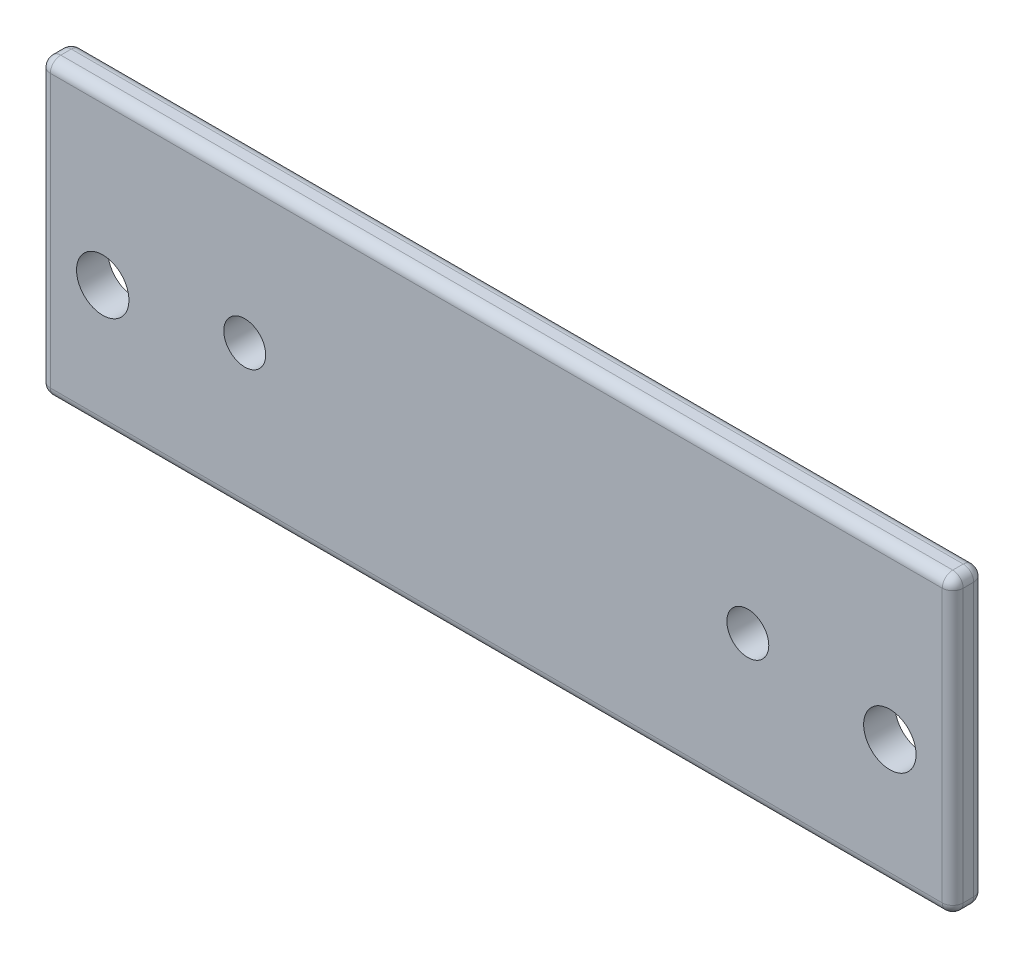
ISO-10303-21;
HEADER;
FILE_DESCRIPTION(('STEP AP214'),'2;1');
FILE_NAME('part.step','',(''),(''),'','','');
FILE_SCHEMA(('AUTOMOTIVE_DESIGN { 1 0 10303 214 1 1 1 1 }'));
ENDSEC;
DATA;
#1=APPLICATION_CONTEXT('core data for automotive mechanical design processes');
#2=APPLICATION_PROTOCOL_DEFINITION('international standard','automotive_design',2000,#1);
#3=PRODUCT_CONTEXT('',#1,'mechanical');
#4=PRODUCT('Part','Part','',(#3));
#5=PRODUCT_RELATED_PRODUCT_CATEGORY('part','',(#4));
#6=PRODUCT_DEFINITION_FORMATION('','',#4);
#7=PRODUCT_DEFINITION_CONTEXT('part definition',#1,'design');
#8=PRODUCT_DEFINITION('design','',#6,#7);
#9=PRODUCT_DEFINITION_SHAPE('','',#8);
#10=(LENGTH_UNIT() NAMED_UNIT(*) SI_UNIT(.MILLI.,.METRE.));
#11=(NAMED_UNIT(*) PLANE_ANGLE_UNIT() SI_UNIT($,.RADIAN.));
#12=(NAMED_UNIT(*) SI_UNIT($,.STERADIAN.) SOLID_ANGLE_UNIT());
#13=UNCERTAINTY_MEASURE_WITH_UNIT(LENGTH_MEASURE(1.E-05),#10,'distance_accuracy_value','');
#14=(GEOMETRIC_REPRESENTATION_CONTEXT(3) GLOBAL_UNCERTAINTY_ASSIGNED_CONTEXT((#13)) GLOBAL_UNIT_ASSIGNED_CONTEXT((#10,
#11,#12)) REPRESENTATION_CONTEXT('',''));
#15=CARTESIAN_POINT('',(0.,0.,0.));
#16=DIRECTION('',(0.,0.,1.));
#17=DIRECTION('',(1.,0.,0.));
#18=AXIS2_PLACEMENT_3D('',#15,#16,#17);
#19=CARTESIAN_POINT('',(-43.552187815,28.,3.));
#20=DIRECTION('',(1.,0.,0.));
#21=DIRECTION('',(0.,0.,-1.));
#22=AXIS2_PLACEMENT_3D('',#19,#20,#21);
#23=PLANE('',#22);
#24=DIRECTION('',(0.,-1.,0.));
#25=VECTOR('',#24,1.);
#26=CARTESIAN_POINT('',(-43.552187815,28.,2.));
#27=LINE('',#26,#25);
#28=CARTESIAN_POINT('',(-43.552187815,1.0000000000001,2.));
#29=VERTEX_POINT('',#28);
#30=CARTESIAN_POINT('',(-43.552187815,27.0000000000001,2.));
#31=VERTEX_POINT('',#30);
#32=EDGE_CURVE('E55',#29,#31,#27,.F.);
#33=ORIENTED_EDGE('',*,*,#32,.T.);
#34=DIRECTION('',(0.,0.,-1.));
#35=VECTOR('',#34,1.);
#36=CARTESIAN_POINT('',(-43.552187815,27.0000000000001,3.));
#37=LINE('',#36,#35);
#38=CARTESIAN_POINT('',(-43.552187815,27.0000000000001,1.));
#39=VERTEX_POINT('',#38);
#40=EDGE_CURVE('E11',#31,#39,#37,.T.);
#41=ORIENTED_EDGE('',*,*,#40,.T.);
#42=DIRECTION('',(0.,-1.,0.));
#43=VECTOR('',#42,1.);
#44=CARTESIAN_POINT('',(-43.552187815,0.,1.));
#45=LINE('',#44,#43);
#46=CARTESIAN_POINT('',(-43.552187815,1.0000000000001,1.));
#47=VERTEX_POINT('',#46);
#48=EDGE_CURVE('E240',#39,#47,#45,.T.);
#49=ORIENTED_EDGE('',*,*,#48,.T.);
#50=DIRECTION('',(0.,0.,-1.));
#51=VECTOR('',#50,1.);
#52=CARTESIAN_POINT('',(-43.552187815,1.0000000000001,3.));
#53=LINE('',#52,#51);
#54=EDGE_CURVE('E66',#47,#29,#53,.F.);
#55=ORIENTED_EDGE('',*,*,#54,.T.);
#56=EDGE_LOOP('',(#33,#41,#49,#55));
#57=FACE_BOUND('',#56,.T.);
#58=ADVANCED_FACE('F45',(#57),#23,.F.);
#59=CARTESIAN_POINT('',(43.552187815,0.,3.));
#60=DIRECTION('',(0.,1.,0.));
#61=DIRECTION('',(-1.,0.,0.));
#62=AXIS2_PLACEMENT_3D('',#59,#60,#61);
#63=PLANE('',#62);
#64=DIRECTION('',(1.,0.,0.));
#65=VECTOR('',#64,1.);
#66=CARTESIAN_POINT('',(43.552187815,0.,1.));
#67=LINE('',#66,#65);
#68=CARTESIAN_POINT('',(-42.552187815,0.,1.));
#69=VERTEX_POINT('',#68);
#70=CARTESIAN_POINT('',(42.552187815,0.,1.));
#71=VERTEX_POINT('',#70);
#72=EDGE_CURVE('E192',#69,#71,#67,.T.);
#73=ORIENTED_EDGE('',*,*,#72,.T.);
#74=DIRECTION('',(0.,0.,-1.));
#75=VECTOR('',#74,1.);
#76=CARTESIAN_POINT('',(42.552187815,0.,3.));
#77=LINE('',#76,#75);
#78=CARTESIAN_POINT('',(42.552187815,0.,2.));
#79=VERTEX_POINT('',#78);
#80=EDGE_CURVE('E199',#71,#79,#77,.F.);
#81=ORIENTED_EDGE('',*,*,#80,.T.);
#82=DIRECTION('',(1.,0.,0.));
#83=VECTOR('',#82,1.);
#84=CARTESIAN_POINT('',(43.552187815,0.,2.));
#85=LINE('',#84,#83);
#86=CARTESIAN_POINT('',(-42.552187815,0.,2.));
#87=VERTEX_POINT('',#86);
#88=EDGE_CURVE('E195',#79,#87,#85,.F.);
#89=ORIENTED_EDGE('',*,*,#88,.T.);
#90=DIRECTION('',(0.,0.,-1.));
#91=VECTOR('',#90,1.);
#92=CARTESIAN_POINT('',(-42.552187815,0.,3.));
#93=LINE('',#92,#91);
#94=EDGE_CURVE('E189',#87,#69,#93,.T.);
#95=ORIENTED_EDGE('',*,*,#94,.T.);
#96=EDGE_LOOP('',(#73,#81,#89,#95));
#97=FACE_BOUND('',#96,.T.);
#98=ADVANCED_FACE('F389',(#97),#63,.F.);
#99=CARTESIAN_POINT('',(43.552187815,28.,3.));
#100=DIRECTION('',(-1.,0.,0.));
#101=DIRECTION('',(0.,0.,1.));
#102=AXIS2_PLACEMENT_3D('',#99,#100,#101);
#103=PLANE('',#102);
#104=DIRECTION('',(0.,1.,0.));
#105=VECTOR('',#104,1.);
#106=CARTESIAN_POINT('',(43.552187815,28.,2.));
#107=LINE('',#106,#105);
#108=CARTESIAN_POINT('',(43.552187815,27.,2.));
#109=VERTEX_POINT('',#108);
#110=CARTESIAN_POINT('',(43.552187815,1.,2.));
#111=VERTEX_POINT('',#110);
#112=EDGE_CURVE('E221',#109,#111,#107,.F.);
#113=ORIENTED_EDGE('',*,*,#112,.T.);
#114=DIRECTION('',(0.,0.,-1.));
#115=VECTOR('',#114,1.);
#116=CARTESIAN_POINT('',(43.552187815,1.,3.));
#117=LINE('',#116,#115);
#118=CARTESIAN_POINT('',(43.552187815,1.,1.));
#119=VERTEX_POINT('',#118);
#120=EDGE_CURVE('E224',#111,#119,#117,.T.);
#121=ORIENTED_EDGE('',*,*,#120,.T.);
#122=DIRECTION('',(0.,1.,0.));
#123=VECTOR('',#122,1.);
#124=CARTESIAN_POINT('',(43.552187815,28.,1.));
#125=LINE('',#124,#123);
#126=CARTESIAN_POINT('',(43.552187815,27.,1.));
#127=VERTEX_POINT('',#126);
#128=EDGE_CURVE('E218',#119,#127,#125,.T.);
#129=ORIENTED_EDGE('',*,*,#128,.T.);
#130=DIRECTION('',(0.,0.,-1.));
#131=VECTOR('',#130,1.);
#132=CARTESIAN_POINT('',(43.552187815,27.,3.));
#133=LINE('',#132,#131);
#134=EDGE_CURVE('E215',#127,#109,#133,.F.);
#135=ORIENTED_EDGE('',*,*,#134,.T.);
#136=EDGE_LOOP('',(#113,#121,#129,#135));
#137=FACE_BOUND('',#136,.T.);
#138=ADVANCED_FACE('F395',(#137),#103,.F.);
#139=CARTESIAN_POINT('',(37.552187815,28.,3.));
#140=DIRECTION('',(0.,-1.,0.));
#141=DIRECTION('',(1.,0.,0.));
#142=AXIS2_PLACEMENT_3D('',#139,#140,#141);
#143=PLANE('',#142);
#144=DIRECTION('',(-1.,0.,0.));
#145=VECTOR('',#144,1.);
#146=CARTESIAN_POINT('',(37.552187815,28.,2.));
#147=LINE('',#146,#145);
#148=CARTESIAN_POINT('',(-42.552187815,28.0000000000001,2.));
#149=VERTEX_POINT('',#148);
#150=CARTESIAN_POINT('',(42.552187815,28.,2.));
#151=VERTEX_POINT('',#150);
#152=EDGE_CURVE('E153',#149,#151,#147,.F.);
#153=ORIENTED_EDGE('',*,*,#152,.T.);
#154=DIRECTION('',(0.,0.,-1.));
#155=VECTOR('',#154,1.);
#156=CARTESIAN_POINT('',(42.552187815,28.,3.));
#157=LINE('',#156,#155);
#158=CARTESIAN_POINT('',(42.552187815,28.,1.));
#159=VERTEX_POINT('',#158);
#160=EDGE_CURVE('E236',#151,#159,#157,.T.);
#161=ORIENTED_EDGE('',*,*,#160,.T.);
#162=DIRECTION('',(-1.,0.,0.));
#163=VECTOR('',#162,1.);
#164=CARTESIAN_POINT('',(-43.552187815,28.0000000000001,1.));
#165=LINE('',#164,#163);
#166=CARTESIAN_POINT('',(-42.552187815,28.0000000000001,1.));
#167=VERTEX_POINT('',#166);
#168=EDGE_CURVE('E231',#159,#167,#165,.T.);
#169=ORIENTED_EDGE('',*,*,#168,.T.);
#170=DIRECTION('',(0.,0.,-1.));
#171=VECTOR('',#170,1.);
#172=CARTESIAN_POINT('',(-42.552187815,28.0000000000001,3.));
#173=LINE('',#172,#171);
#174=EDGE_CURVE('E228',#167,#149,#173,.F.);
#175=ORIENTED_EDGE('',*,*,#174,.T.);
#176=EDGE_LOOP('',(#153,#161,#169,#175));
#177=FACE_BOUND('',#176,.T.);
#178=ADVANCED_FACE('F366',(#177),#143,.F.);
#179=CARTESIAN_POINT('',(0.,0.,3.));
#180=DIRECTION('',(0.,0.,-1.));
#181=DIRECTION('',(-1.,0.,0.));
#182=AXIS2_PLACEMENT_3D('',#179,#180,#181);
#183=PLANE('',#182);
#184=DIRECTION('',(0.,-1.,0.));
#185=VECTOR('',#184,1.);
#186=CARTESIAN_POINT('',(-42.552187815,0.,3.));
#187=LINE('',#186,#185);
#188=CARTESIAN_POINT('',(-42.552187815,27.0000000000001,3.));
#189=VERTEX_POINT('',#188);
#190=CARTESIAN_POINT('',(-42.552187815,1.0000000000001,3.));
#191=VERTEX_POINT('',#190);
#192=EDGE_CURVE('E139',#189,#191,#187,.T.);
#193=ORIENTED_EDGE('',*,*,#192,.T.);
#194=DIRECTION('',(1.,0.,0.));
#195=VECTOR('',#194,1.);
#196=CARTESIAN_POINT('',(0.,1.00000000000005,3.));
#197=LINE('',#196,#195);
#198=CARTESIAN_POINT('',(42.552187815,1.,3.));
#199=VERTEX_POINT('',#198);
#200=EDGE_CURVE('E186',#191,#199,#197,.T.);
#201=ORIENTED_EDGE('',*,*,#200,.T.);
#202=DIRECTION('',(0.,1.,0.));
#203=VECTOR('',#202,1.);
#204=CARTESIAN_POINT('',(42.552187815,0.,3.));
#205=LINE('',#204,#203);
#206=CARTESIAN_POINT('',(42.552187815,27.,3.));
#207=VERTEX_POINT('',#206);
#208=EDGE_CURVE('E142',#199,#207,#205,.T.);
#209=ORIENTED_EDGE('',*,*,#208,.T.);
#210=DIRECTION('',(-1.,0.,0.));
#211=VECTOR('',#210,1.);
#212=CARTESIAN_POINT('',(0.,27.,3.));
#213=LINE('',#212,#211);
#214=EDGE_CURVE('E133',#207,#189,#213,.T.);
#215=ORIENTED_EDGE('',*,*,#214,.T.);
#216=EDGE_LOOP('',(#193,#201,#209,#215));
#217=FACE_BOUND('',#216,.T.);
#218=CARTESIAN_POINT('',(-24.,14.,3.));
#219=DIRECTION('',(0.,0.,1.));
#220=DIRECTION('',(1.,0.,0.));
#221=AXIS2_PLACEMENT_3D('',#218,#219,#220);
#222=CIRCLE('',#221,2.00000000000001);
#223=CARTESIAN_POINT('',(-22.,14.,3.));
#224=VERTEX_POINT('',#223);
#225=EDGE_CURVE('E336',#224,#224,#222,.T.);
#226=ORIENTED_EDGE('',*,*,#225,.F.);
#227=EDGE_LOOP('',(#226));
#228=FACE_BOUND('',#227,.T.);
#229=CARTESIAN_POINT('',(24.,14.,3.));
#230=DIRECTION('',(0.,0.,1.));
#231=DIRECTION('',(1.,0.,0.));
#232=AXIS2_PLACEMENT_3D('',#229,#230,#231);
#233=CIRCLE('',#232,2.);
#234=CARTESIAN_POINT('',(26.,14.,3.));
#235=VERTEX_POINT('',#234);
#236=EDGE_CURVE('E330',#235,#235,#233,.T.);
#237=ORIENTED_EDGE('',*,*,#236,.F.);
#238=EDGE_LOOP('',(#237));
#239=FACE_BOUND('',#238,.T.);
#240=CARTESIAN_POINT('',(-37.552187815,12.,3.));
#241=DIRECTION('',(0.,0.,1.));
#242=DIRECTION('',(1.,0.,0.));
#243=AXIS2_PLACEMENT_3D('',#240,#241,#242);
#244=CIRCLE('',#243,2.5);
#245=CARTESIAN_POINT('',(-35.052187815,12.,3.));
#246=VERTEX_POINT('',#245);
#247=EDGE_CURVE('E178',#246,#246,#244,.T.);
#248=ORIENTED_EDGE('',*,*,#247,.F.);
#249=EDGE_LOOP('',(#248));
#250=FACE_BOUND('',#249,.T.);
#251=CARTESIAN_POINT('',(37.552187815,12.,3.));
#252=DIRECTION('',(0.,0.,1.));
#253=DIRECTION('',(1.,0.,0.));
#254=AXIS2_PLACEMENT_3D('',#251,#252,#253);
#255=CIRCLE('',#254,2.5);
#256=CARTESIAN_POINT('',(40.052187815,12.,3.));
#257=VERTEX_POINT('',#256);
#258=EDGE_CURVE('E344',#257,#257,#255,.T.);
#259=ORIENTED_EDGE('',*,*,#258,.F.);
#260=EDGE_LOOP('',(#259));
#261=FACE_BOUND('',#260,.T.);
#262=ADVANCED_FACE('F135',(#217,#228,#239,#250,#261),#183,.F.);
#263=CARTESIAN_POINT('',(0.,0.,0.));
#264=DIRECTION('',(0.,0.,-1.));
#265=DIRECTION('',(-1.,0.,0.));
#266=AXIS2_PLACEMENT_3D('',#263,#264,#265);
#267=PLANE('',#266);
#268=DIRECTION('',(0.,1.,0.));
#269=VECTOR('',#268,1.);
#270=CARTESIAN_POINT('',(42.552187815,0.,0.));
#271=LINE('',#270,#269);
#272=CARTESIAN_POINT('',(42.552187815,27.,0.));
#273=VERTEX_POINT('',#272);
#274=CARTESIAN_POINT('',(42.552187815,1.,0.));
#275=VERTEX_POINT('',#274);
#276=EDGE_CURVE('E208',#273,#275,#271,.F.);
#277=ORIENTED_EDGE('',*,*,#276,.T.);
#278=DIRECTION('',(1.,0.,0.));
#279=VECTOR('',#278,1.);
#280=CARTESIAN_POINT('',(-43.552187815,1.0000000000001,0.));
#281=LINE('',#280,#279);
#282=CARTESIAN_POINT('',(-42.552187815,1.0000000000001,0.));
#283=VERTEX_POINT('',#282);
#284=EDGE_CURVE('E211',#275,#283,#281,.F.);
#285=ORIENTED_EDGE('',*,*,#284,.T.);
#286=DIRECTION('',(0.,-1.,0.));
#287=VECTOR('',#286,1.);
#288=CARTESIAN_POINT('',(-42.552187815,28.,0.));
#289=LINE('',#288,#287);
#290=CARTESIAN_POINT('',(-42.552187815,27.0000000000001,0.));
#291=VERTEX_POINT('',#290);
#292=EDGE_CURVE('E202',#283,#291,#289,.F.);
#293=ORIENTED_EDGE('',*,*,#292,.T.);
#294=DIRECTION('',(-1.,0.,0.));
#295=VECTOR('',#294,1.);
#296=CARTESIAN_POINT('',(43.552187815,27.,0.));
#297=LINE('',#296,#295);
#298=EDGE_CURVE('E205',#291,#273,#297,.F.);
#299=ORIENTED_EDGE('',*,*,#298,.T.);
#300=EDGE_LOOP('',(#277,#285,#293,#299));
#301=FACE_BOUND('',#300,.T.);
#302=CARTESIAN_POINT('',(-24.,14.,0.));
#303=DIRECTION('',(0.,0.,-1.));
#304=DIRECTION('',(-1.,0.,0.));
#305=AXIS2_PLACEMENT_3D('',#302,#303,#304);
#306=CIRCLE('',#305,2.00000000000001);
#307=CARTESIAN_POINT('',(-26.,14.,0.));
#308=VERTEX_POINT('',#307);
#309=EDGE_CURVE('E339',#308,#308,#306,.F.);
#310=ORIENTED_EDGE('',*,*,#309,.T.);
#311=EDGE_LOOP('',(#310));
#312=FACE_BOUND('',#311,.T.);
#313=CARTESIAN_POINT('',(24.,14.,0.));
#314=DIRECTION('',(0.,0.,-1.));
#315=DIRECTION('',(-1.,0.,0.));
#316=AXIS2_PLACEMENT_3D('',#313,#314,#315);
#317=CIRCLE('',#316,2.);
#318=CARTESIAN_POINT('',(22.,14.,0.));
#319=VERTEX_POINT('',#318);
#320=EDGE_CURVE('E323',#319,#319,#317,.F.);
#321=ORIENTED_EDGE('',*,*,#320,.T.);
#322=EDGE_LOOP('',(#321));
#323=FACE_BOUND('',#322,.T.);
#324=CARTESIAN_POINT('',(-37.552187815,12.,0.));
#325=DIRECTION('',(0.,0.,1.));
#326=DIRECTION('',(1.,0.,0.));
#327=AXIS2_PLACEMENT_3D('',#324,#325,#326);
#328=CIRCLE('',#327,2.5);
#329=CARTESIAN_POINT('',(-35.052187815,12.,0.));
#330=VERTEX_POINT('',#329);
#331=EDGE_CURVE('E174',#330,#330,#328,.T.);
#332=ORIENTED_EDGE('',*,*,#331,.T.);
#333=EDGE_LOOP('',(#332));
#334=FACE_BOUND('',#333,.T.);
#335=CARTESIAN_POINT('',(37.552187815,12.,0.));
#336=DIRECTION('',(0.,0.,1.));
#337=DIRECTION('',(1.,0.,0.));
#338=AXIS2_PLACEMENT_3D('',#335,#336,#337);
#339=CIRCLE('',#338,2.5);
#340=CARTESIAN_POINT('',(40.052187815,12.,0.));
#341=VERTEX_POINT('',#340);
#342=EDGE_CURVE('E181',#341,#341,#339,.T.);
#343=ORIENTED_EDGE('',*,*,#342,.T.);
#344=EDGE_LOOP('',(#343));
#345=FACE_BOUND('',#344,.T.);
#346=ADVANCED_FACE('F365',(#301,#312,#323,#334,#345),#267,.T.);
#347=CARTESIAN_POINT('',(37.552187815,12.,0.));
#348=DIRECTION('',(0.,0.,1.));
#349=DIRECTION('',(1.,0.,0.));
#350=AXIS2_PLACEMENT_3D('',#347,#348,#349);
#351=CYLINDRICAL_SURFACE('',#350,2.5);
#352=ORIENTED_EDGE('',*,*,#342,.F.);
#353=EDGE_LOOP('',(#352));
#354=FACE_BOUND('',#353,.T.);
#355=ORIENTED_EDGE('',*,*,#258,.T.);
#356=EDGE_LOOP('',(#355));
#357=FACE_BOUND('',#356,.T.);
#358=ADVANCED_FACE('F376',(#354,#357),#351,.F.);
#359=CARTESIAN_POINT('',(-37.552187815,12.,0.));
#360=DIRECTION('',(0.,0.,1.));
#361=DIRECTION('',(1.,0.,0.));
#362=AXIS2_PLACEMENT_3D('',#359,#360,#361);
#363=CYLINDRICAL_SURFACE('',#362,2.5);
#364=ORIENTED_EDGE('',*,*,#331,.F.);
#365=EDGE_LOOP('',(#364));
#366=FACE_BOUND('',#365,.T.);
#367=ORIENTED_EDGE('',*,*,#247,.T.);
#368=EDGE_LOOP('',(#367));
#369=FACE_BOUND('',#368,.T.);
#370=ADVANCED_FACE('F373',(#366,#369),#363,.F.);
#371=CARTESIAN_POINT('',(24.,14.,-5.6568542494924));
#372=DIRECTION('',(0.,0.,1.));
#373=DIRECTION('',(1.,0.,0.));
#374=AXIS2_PLACEMENT_3D('',#371,#372,#373);
#375=CYLINDRICAL_SURFACE('',#374,2.);
#376=ORIENTED_EDGE('',*,*,#236,.T.);
#377=EDGE_LOOP('',(#376));
#378=FACE_BOUND('',#377,.T.);
#379=ORIENTED_EDGE('',*,*,#320,.F.);
#380=EDGE_LOOP('',(#379));
#381=FACE_BOUND('',#380,.T.);
#382=ADVANCED_FACE('F375',(#378,#381),#375,.F.);
#383=CARTESIAN_POINT('',(-24.,14.,-5.6568542494924));
#384=DIRECTION('',(0.,0.,1.));
#385=DIRECTION('',(1.,0.,0.));
#386=AXIS2_PLACEMENT_3D('',#383,#384,#385);
#387=CYLINDRICAL_SURFACE('',#386,2.00000000000001);
#388=ORIENTED_EDGE('',*,*,#225,.T.);
#389=EDGE_LOOP('',(#388));
#390=FACE_BOUND('',#389,.T.);
#391=ORIENTED_EDGE('',*,*,#309,.F.);
#392=EDGE_LOOP('',(#391));
#393=FACE_BOUND('',#392,.T.);
#394=ADVANCED_FACE('F361',(#390,#393),#387,.F.);
#395=CARTESIAN_POINT('',(37.552187815,27.,1.));
#396=DIRECTION('',(1.,0.,0.));
#397=DIRECTION('',(0.,1.,0.));
#398=AXIS2_PLACEMENT_3D('',#395,#396,#397);
#399=CYLINDRICAL_SURFACE('',#398,1.);
#400=CARTESIAN_POINT('',(-42.552187815,27.0000000000001,1.));
#401=DIRECTION('',(-1.,0.,0.));
#402=DIRECTION('',(0.,0.,1.));
#403=AXIS2_PLACEMENT_3D('',#400,#401,#402);
#404=CIRCLE('',#403,1.);
#405=EDGE_CURVE('E49',#167,#291,#404,.T.);
#406=ORIENTED_EDGE('',*,*,#405,.F.);
#407=ORIENTED_EDGE('',*,*,#168,.F.);
#408=CARTESIAN_POINT('',(42.552187815,27.,1.));
#409=DIRECTION('',(1.,0.,0.));
#410=DIRECTION('',(0.,0.,-1.));
#411=AXIS2_PLACEMENT_3D('',#408,#409,#410);
#412=CIRCLE('',#411,1.);
#413=EDGE_CURVE('E313',#273,#159,#412,.T.);
#414=ORIENTED_EDGE('',*,*,#413,.F.);
#415=ORIENTED_EDGE('',*,*,#298,.F.);
#416=EDGE_LOOP('',(#406,#407,#414,#415));
#417=FACE_BOUND('',#416,.T.);
#418=ADVANCED_FACE('F47',(#417),#399,.T.);
#419=CARTESIAN_POINT('',(-42.552187815,27.0000000000001,1.));
#420=DIRECTION('',(0.,0.,-1.));
#421=DIRECTION('',(-1.,0.,0.));
#422=AXIS2_PLACEMENT_3D('',#419,#420,#421);
#423=SPHERICAL_SURFACE('',#422,1.);
#424=CARTESIAN_POINT('',(-42.552187815,27.0000000000001,1.));
#425=DIRECTION('',(0.,0.,-1.));
#426=DIRECTION('',(-1.,0.,0.));
#427=AXIS2_PLACEMENT_3D('',#424,#425,#426);
#428=CIRCLE('',#427,1.);
#429=EDGE_CURVE('E306',#167,#39,#428,.F.);
#430=ORIENTED_EDGE('',*,*,#429,.F.);
#431=ORIENTED_EDGE('',*,*,#405,.T.);
#432=CARTESIAN_POINT('',(-42.552187815,27.0000000000001,1.));
#433=DIRECTION('',(0.,1.,0.));
#434=DIRECTION('',(0.,0.,1.));
#435=AXIS2_PLACEMENT_3D('',#432,#433,#434);
#436=CIRCLE('',#435,1.);
#437=EDGE_CURVE('E310',#39,#291,#436,.F.);
#438=ORIENTED_EDGE('',*,*,#437,.F.);
#439=EDGE_LOOP('',(#430,#431,#438));
#440=FACE_BOUND('',#439,.T.);
#441=ADVANCED_FACE('F464',(#440),#423,.T.);
#442=CARTESIAN_POINT('',(42.552187815,27.,1.));
#443=DIRECTION('',(0.,1.,0.));
#444=DIRECTION('',(0.,0.,1.));
#445=AXIS2_PLACEMENT_3D('',#442,#443,#444);
#446=SPHERICAL_SURFACE('',#445,1.);
#447=CARTESIAN_POINT('',(42.552187815,27.,1.));
#448=DIRECTION('',(0.,1.,0.));
#449=DIRECTION('',(0.,0.,1.));
#450=AXIS2_PLACEMENT_3D('',#447,#448,#449);
#451=CIRCLE('',#450,1.);
#452=EDGE_CURVE('E299',#273,#127,#451,.F.);
#453=ORIENTED_EDGE('',*,*,#452,.F.);
#454=ORIENTED_EDGE('',*,*,#413,.T.);
#455=CARTESIAN_POINT('',(42.552187815,27.,1.));
#456=DIRECTION('',(0.,0.,-1.));
#457=DIRECTION('',(-1.,0.,0.));
#458=AXIS2_PLACEMENT_3D('',#455,#456,#457);
#459=CIRCLE('',#458,1.);
#460=EDGE_CURVE('E303',#127,#159,#459,.F.);
#461=ORIENTED_EDGE('',*,*,#460,.F.);
#462=EDGE_LOOP('',(#453,#454,#461));
#463=FACE_BOUND('',#462,.T.);
#464=ADVANCED_FACE('F461',(#463),#446,.T.);
#465=CARTESIAN_POINT('',(-42.552187815,28.,1.));
#466=DIRECTION('',(0.,1.,0.));
#467=DIRECTION('',(0.,0.,1.));
#468=AXIS2_PLACEMENT_3D('',#465,#466,#467);
#469=CYLINDRICAL_SURFACE('',#468,1.);
#470=ORIENTED_EDGE('',*,*,#437,.T.);
#471=ORIENTED_EDGE('',*,*,#292,.F.);
#472=CARTESIAN_POINT('',(-42.552187815,1.0000000000001,1.));
#473=DIRECTION('',(0.,-1.,0.));
#474=DIRECTION('',(0.,0.,-1.));
#475=AXIS2_PLACEMENT_3D('',#472,#473,#474);
#476=CIRCLE('',#475,1.);
#477=EDGE_CURVE('E292',#47,#283,#476,.T.);
#478=ORIENTED_EDGE('',*,*,#477,.F.);
#479=ORIENTED_EDGE('',*,*,#48,.F.);
#480=EDGE_LOOP('',(#470,#471,#478,#479));
#481=FACE_BOUND('',#480,.T.);
#482=ADVANCED_FACE('F457',(#481),#469,.T.);
#483=CARTESIAN_POINT('',(-42.552187815,27.0000000000001,3.));
#484=DIRECTION('',(0.,0.,-1.));
#485=DIRECTION('',(-1.,0.,0.));
#486=AXIS2_PLACEMENT_3D('',#483,#484,#485);
#487=CYLINDRICAL_SURFACE('',#486,1.);
#488=ORIENTED_EDGE('',*,*,#429,.T.);
#489=ORIENTED_EDGE('',*,*,#40,.F.);
#490=CARTESIAN_POINT('',(-42.552187815,27.0000000000001,2.));
#491=DIRECTION('',(0.,0.,1.));
#492=DIRECTION('',(1.,0.,0.));
#493=AXIS2_PLACEMENT_3D('',#490,#491,#492);
#494=CIRCLE('',#493,1.);
#495=EDGE_CURVE('E158',#149,#31,#494,.T.);
#496=ORIENTED_EDGE('',*,*,#495,.F.);
#497=ORIENTED_EDGE('',*,*,#174,.F.);
#498=EDGE_LOOP('',(#488,#489,#496,#497));
#499=FACE_BOUND('',#498,.T.);
#500=ADVANCED_FACE('F454',(#499),#487,.T.);
#501=CARTESIAN_POINT('',(0.,27.,2.));
#502=DIRECTION('',(-1.,0.,0.));
#503=DIRECTION('',(0.,-1.,0.));
#504=AXIS2_PLACEMENT_3D('',#501,#502,#503);
#505=CYLINDRICAL_SURFACE('',#504,1.);
#506=CARTESIAN_POINT('',(42.552187815,27.,2.));
#507=DIRECTION('',(1.,0.,0.));
#508=DIRECTION('',(0.,0.,-1.));
#509=AXIS2_PLACEMENT_3D('',#506,#507,#508);
#510=CIRCLE('',#509,1.);
#511=EDGE_CURVE('E159',#151,#207,#510,.T.);
#512=ORIENTED_EDGE('',*,*,#511,.F.);
#513=ORIENTED_EDGE('',*,*,#152,.F.);
#514=CARTESIAN_POINT('',(-42.552187815,27.0000000000001,2.));
#515=DIRECTION('',(-1.,0.,0.));
#516=DIRECTION('',(0.,0.,1.));
#517=AXIS2_PLACEMENT_3D('',#514,#515,#516);
#518=CIRCLE('',#517,1.);
#519=EDGE_CURVE('E150',#189,#149,#518,.T.);
#520=ORIENTED_EDGE('',*,*,#519,.F.);
#521=ORIENTED_EDGE('',*,*,#214,.F.);
#522=EDGE_LOOP('',(#512,#513,#520,#521));
#523=FACE_BOUND('',#522,.T.);
#524=ADVANCED_FACE('F152',(#523),#505,.T.);
#525=CARTESIAN_POINT('',(42.552187815,27.,3.));
#526=DIRECTION('',(0.,0.,-1.));
#527=DIRECTION('',(-1.,0.,0.));
#528=AXIS2_PLACEMENT_3D('',#525,#526,#527);
#529=CYLINDRICAL_SURFACE('',#528,1.);
#530=ORIENTED_EDGE('',*,*,#460,.T.);
#531=ORIENTED_EDGE('',*,*,#160,.F.);
#532=CARTESIAN_POINT('',(42.552187815,27.,2.));
#533=DIRECTION('',(0.,0.,1.));
#534=DIRECTION('',(1.,0.,0.));
#535=AXIS2_PLACEMENT_3D('',#532,#533,#534);
#536=CIRCLE('',#535,1.);
#537=EDGE_CURVE('E284',#109,#151,#536,.T.);
#538=ORIENTED_EDGE('',*,*,#537,.F.);
#539=ORIENTED_EDGE('',*,*,#134,.F.);
#540=EDGE_LOOP('',(#530,#531,#538,#539));
#541=FACE_BOUND('',#540,.T.);
#542=ADVANCED_FACE('F447',(#541),#529,.T.);
#543=CARTESIAN_POINT('',(42.552187815,28.,1.));
#544=DIRECTION('',(0.,-1.,0.));
#545=DIRECTION('',(0.,0.,-1.));
#546=AXIS2_PLACEMENT_3D('',#543,#544,#545);
#547=CYLINDRICAL_SURFACE('',#546,1.);
#548=ORIENTED_EDGE('',*,*,#452,.T.);
#549=ORIENTED_EDGE('',*,*,#128,.F.);
#550=CARTESIAN_POINT('',(42.552187815,1.,1.));
#551=DIRECTION('',(0.,-1.,0.));
#552=DIRECTION('',(1.,0.,0.));
#553=AXIS2_PLACEMENT_3D('',#550,#551,#552);
#554=CIRCLE('',#553,1.);
#555=EDGE_CURVE('E280',#275,#119,#554,.T.);
#556=ORIENTED_EDGE('',*,*,#555,.F.);
#557=ORIENTED_EDGE('',*,*,#276,.F.);
#558=EDGE_LOOP('',(#548,#549,#556,#557));
#559=FACE_BOUND('',#558,.T.);
#560=ADVANCED_FACE('F443',(#559),#547,.T.);
#561=CARTESIAN_POINT('',(43.552187815,1.,1.));
#562=DIRECTION('',(-1.,0.,0.));
#563=DIRECTION('',(0.,-1.,0.));
#564=AXIS2_PLACEMENT_3D('',#561,#562,#563);
#565=CYLINDRICAL_SURFACE('',#564,1.);
#566=CARTESIAN_POINT('',(-42.552187815,1.0000000000001,1.));
#567=DIRECTION('',(-1.,0.,0.));
#568=DIRECTION('',(0.,0.,1.));
#569=AXIS2_PLACEMENT_3D('',#566,#567,#568);
#570=CIRCLE('',#569,1.);
#571=EDGE_CURVE('E295',#283,#69,#570,.T.);
#572=ORIENTED_EDGE('',*,*,#571,.F.);
#573=ORIENTED_EDGE('',*,*,#284,.F.);
#574=CARTESIAN_POINT('',(42.552187815,1.,1.));
#575=DIRECTION('',(1.,0.,0.));
#576=DIRECTION('',(0.,0.,-1.));
#577=AXIS2_PLACEMENT_3D('',#574,#575,#576);
#578=CIRCLE('',#577,1.);
#579=EDGE_CURVE('E276',#71,#275,#578,.T.);
#580=ORIENTED_EDGE('',*,*,#579,.F.);
#581=ORIENTED_EDGE('',*,*,#72,.F.);
#582=EDGE_LOOP('',(#572,#573,#580,#581));
#583=FACE_BOUND('',#582,.T.);
#584=ADVANCED_FACE('F439',(#583),#565,.T.);
#585=CARTESIAN_POINT('',(-42.552187815,1.0000000000001,1.));
#586=DIRECTION('',(0.,0.,-1.));
#587=DIRECTION('',(0.,1.,0.));
#588=AXIS2_PLACEMENT_3D('',#585,#586,#587);
#589=SPHERICAL_SURFACE('',#588,1.);
#590=ORIENTED_EDGE('',*,*,#477,.T.);
#591=ORIENTED_EDGE('',*,*,#571,.T.);
#592=CARTESIAN_POINT('',(-42.552187815,1.0000000000001,1.));
#593=DIRECTION('',(0.,0.,-1.));
#594=DIRECTION('',(-1.,0.,0.));
#595=AXIS2_PLACEMENT_3D('',#592,#593,#594);
#596=CIRCLE('',#595,1.);
#597=EDGE_CURVE('E166',#47,#69,#596,.F.);
#598=ORIENTED_EDGE('',*,*,#597,.F.);
#599=EDGE_LOOP('',(#590,#591,#598));
#600=FACE_BOUND('',#599,.T.);
#601=ADVANCED_FACE('F436',(#600),#589,.T.);
#602=CARTESIAN_POINT('',(-42.552187815,27.0000000000001,2.));
#603=DIRECTION('',(0.,1.,0.));
#604=DIRECTION('',(0.,0.,1.));
#605=AXIS2_PLACEMENT_3D('',#602,#603,#604);
#606=SPHERICAL_SURFACE('',#605,1.);
#607=ORIENTED_EDGE('',*,*,#519,.T.);
#608=ORIENTED_EDGE('',*,*,#495,.T.);
#609=CARTESIAN_POINT('',(-42.552187815,27.0000000000001,2.));
#610=DIRECTION('',(0.,1.,0.));
#611=DIRECTION('',(0.,0.,1.));
#612=AXIS2_PLACEMENT_3D('',#609,#610,#611);
#613=CIRCLE('',#612,1.);
#614=EDGE_CURVE('E162',#189,#31,#613,.F.);
#615=ORIENTED_EDGE('',*,*,#614,.F.);
#616=EDGE_LOOP('',(#607,#608,#615));
#617=FACE_BOUND('',#616,.T.);
#618=ADVANCED_FACE('F163',(#617),#606,.T.);
#619=CARTESIAN_POINT('',(42.552187815,27.,2.));
#620=DIRECTION('',(0.,1.,0.));
#621=DIRECTION('',(0.,0.,1.));
#622=AXIS2_PLACEMENT_3D('',#619,#620,#621);
#623=SPHERICAL_SURFACE('',#622,1.);
#624=ORIENTED_EDGE('',*,*,#537,.T.);
#625=ORIENTED_EDGE('',*,*,#511,.T.);
#626=CARTESIAN_POINT('',(42.552187815,27.,2.));
#627=DIRECTION('',(0.,1.,0.));
#628=DIRECTION('',(0.,0.,1.));
#629=AXIS2_PLACEMENT_3D('',#626,#627,#628);
#630=CIRCLE('',#629,1.);
#631=EDGE_CURVE('E167',#109,#207,#630,.F.);
#632=ORIENTED_EDGE('',*,*,#631,.F.);
#633=EDGE_LOOP('',(#624,#625,#632));
#634=FACE_BOUND('',#633,.T.);
#635=ADVANCED_FACE('F429',(#634),#623,.T.);
#636=CARTESIAN_POINT('',(42.552187815,1.,1.));
#637=DIRECTION('',(0.,0.,-1.));
#638=DIRECTION('',(0.,1.,0.));
#639=AXIS2_PLACEMENT_3D('',#636,#637,#638);
#640=SPHERICAL_SURFACE('',#639,1.);
#641=ORIENTED_EDGE('',*,*,#579,.T.);
#642=ORIENTED_EDGE('',*,*,#555,.T.);
#643=CARTESIAN_POINT('',(42.552187815,1.,1.));
#644=DIRECTION('',(0.,0.,-1.));
#645=DIRECTION('',(-1.,0.,0.));
#646=AXIS2_PLACEMENT_3D('',#643,#644,#645);
#647=CIRCLE('',#646,1.);
#648=EDGE_CURVE('E267',#71,#119,#647,.F.);
#649=ORIENTED_EDGE('',*,*,#648,.F.);
#650=EDGE_LOOP('',(#641,#642,#649));
#651=FACE_BOUND('',#650,.T.);
#652=ADVANCED_FACE('F425',(#651),#640,.T.);
#653=CARTESIAN_POINT('',(-42.552187815,1.0000000000001,3.));
#654=DIRECTION('',(0.,0.,-1.));
#655=DIRECTION('',(-1.,0.,0.));
#656=AXIS2_PLACEMENT_3D('',#653,#654,#655);
#657=CYLINDRICAL_SURFACE('',#656,1.);
#658=ORIENTED_EDGE('',*,*,#597,.T.);
#659=ORIENTED_EDGE('',*,*,#94,.F.);
#660=CARTESIAN_POINT('',(-42.552187815,1.0000000000001,2.));
#661=DIRECTION('',(0.,0.,1.));
#662=DIRECTION('',(1.,0.,0.));
#663=AXIS2_PLACEMENT_3D('',#660,#661,#662);
#664=CIRCLE('',#663,1.);
#665=EDGE_CURVE('E263',#29,#87,#664,.T.);
#666=ORIENTED_EDGE('',*,*,#665,.F.);
#667=ORIENTED_EDGE('',*,*,#54,.F.);
#668=EDGE_LOOP('',(#658,#659,#666,#667));
#669=FACE_BOUND('',#668,.T.);
#670=ADVANCED_FACE('F422',(#669),#657,.T.);
#671=CARTESIAN_POINT('',(-42.552187815,0.,2.));
#672=DIRECTION('',(0.,-1.,0.));
#673=DIRECTION('',(0.,0.,-1.));
#674=AXIS2_PLACEMENT_3D('',#671,#672,#673);
#675=CYLINDRICAL_SURFACE('',#674,1.);
#676=ORIENTED_EDGE('',*,*,#614,.T.);
#677=ORIENTED_EDGE('',*,*,#32,.F.);
#678=CARTESIAN_POINT('',(-42.552187815,1.0000000000001,2.));
#679=DIRECTION('',(0.,-1.,0.));
#680=DIRECTION('',(0.,0.,-1.));
#681=AXIS2_PLACEMENT_3D('',#678,#679,#680);
#682=CIRCLE('',#681,1.);
#683=EDGE_CURVE('E171',#191,#29,#682,.T.);
#684=ORIENTED_EDGE('',*,*,#683,.F.);
#685=ORIENTED_EDGE('',*,*,#192,.F.);
#686=EDGE_LOOP('',(#676,#677,#684,#685));
#687=FACE_BOUND('',#686,.T.);
#688=ADVANCED_FACE('F169',(#687),#675,.T.);
#689=CARTESIAN_POINT('',(42.552187815,0.,2.));
#690=DIRECTION('',(0.,1.,0.));
#691=DIRECTION('',(0.,0.,1.));
#692=AXIS2_PLACEMENT_3D('',#689,#690,#691);
#693=CYLINDRICAL_SURFACE('',#692,1.);
#694=ORIENTED_EDGE('',*,*,#631,.T.);
#695=ORIENTED_EDGE('',*,*,#208,.F.);
#696=CARTESIAN_POINT('',(42.552187815,1.,2.));
#697=DIRECTION('',(0.,-1.,0.));
#698=DIRECTION('',(0.,0.,-1.));
#699=AXIS2_PLACEMENT_3D('',#696,#697,#698);
#700=CIRCLE('',#699,1.);
#701=EDGE_CURVE('E257',#111,#199,#700,.T.);
#702=ORIENTED_EDGE('',*,*,#701,.F.);
#703=ORIENTED_EDGE('',*,*,#112,.F.);
#704=EDGE_LOOP('',(#694,#695,#702,#703));
#705=FACE_BOUND('',#704,.T.);
#706=ADVANCED_FACE('F415',(#705),#693,.T.);
#707=CARTESIAN_POINT('',(42.552187815,1.,3.));
#708=DIRECTION('',(0.,0.,-1.));
#709=DIRECTION('',(-1.,0.,0.));
#710=AXIS2_PLACEMENT_3D('',#707,#708,#709);
#711=CYLINDRICAL_SURFACE('',#710,1.);
#712=ORIENTED_EDGE('',*,*,#648,.T.);
#713=ORIENTED_EDGE('',*,*,#120,.F.);
#714=CARTESIAN_POINT('',(42.552187815,1.,2.));
#715=DIRECTION('',(0.,0.,1.));
#716=DIRECTION('',(1.,0.,0.));
#717=AXIS2_PLACEMENT_3D('',#714,#715,#716);
#718=CIRCLE('',#717,1.);
#719=EDGE_CURVE('E253',#79,#111,#718,.T.);
#720=ORIENTED_EDGE('',*,*,#719,.F.);
#721=ORIENTED_EDGE('',*,*,#80,.F.);
#722=EDGE_LOOP('',(#712,#713,#720,#721));
#723=FACE_BOUND('',#722,.T.);
#724=ADVANCED_FACE('F411',(#723),#711,.T.);
#725=CARTESIAN_POINT('',(-42.552187815,1.0000000000001,2.));
#726=DIRECTION('',(-1.,0.,0.));
#727=DIRECTION('',(0.,0.,1.));
#728=AXIS2_PLACEMENT_3D('',#725,#726,#727);
#729=SPHERICAL_SURFACE('',#728,1.);
#730=ORIENTED_EDGE('',*,*,#683,.T.);
#731=ORIENTED_EDGE('',*,*,#665,.T.);
#732=CARTESIAN_POINT('',(-42.552187815,1.0000000000001,2.));
#733=DIRECTION('',(-1.,0.,0.));
#734=DIRECTION('',(0.,0.,1.));
#735=AXIS2_PLACEMENT_3D('',#732,#733,#734);
#736=CIRCLE('',#735,1.);
#737=EDGE_CURVE('E250',#191,#87,#736,.F.);
#738=ORIENTED_EDGE('',*,*,#737,.F.);
#739=EDGE_LOOP('',(#730,#731,#738));
#740=FACE_BOUND('',#739,.T.);
#741=ADVANCED_FACE('F407',(#740),#729,.T.);
#742=CARTESIAN_POINT('',(42.552187815,1.,2.));
#743=DIRECTION('',(1.,0.,0.));
#744=DIRECTION('',(0.,1.,0.));
#745=AXIS2_PLACEMENT_3D('',#742,#743,#744);
#746=SPHERICAL_SURFACE('',#745,1.);
#747=ORIENTED_EDGE('',*,*,#719,.T.);
#748=ORIENTED_EDGE('',*,*,#701,.T.);
#749=CARTESIAN_POINT('',(42.552187815,1.,2.));
#750=DIRECTION('',(1.,0.,0.));
#751=DIRECTION('',(0.,0.,-1.));
#752=AXIS2_PLACEMENT_3D('',#749,#750,#751);
#753=CIRCLE('',#752,1.);
#754=EDGE_CURVE('E247',#79,#199,#753,.F.);
#755=ORIENTED_EDGE('',*,*,#754,.F.);
#756=EDGE_LOOP('',(#747,#748,#755));
#757=FACE_BOUND('',#756,.T.);
#758=ADVANCED_FACE('F403',(#757),#746,.T.);
#759=CARTESIAN_POINT('',(0.,1.00000000000005,2.));
#760=DIRECTION('',(1.,0.,0.));
#761=DIRECTION('',(0.,1.,0.));
#762=AXIS2_PLACEMENT_3D('',#759,#760,#761);
#763=CYLINDRICAL_SURFACE('',#762,1.);
#764=ORIENTED_EDGE('',*,*,#737,.T.);
#765=ORIENTED_EDGE('',*,*,#88,.F.);
#766=ORIENTED_EDGE('',*,*,#754,.T.);
#767=ORIENTED_EDGE('',*,*,#200,.F.);
#768=EDGE_LOOP('',(#764,#765,#766,#767));
#769=FACE_BOUND('',#768,.T.);
#770=ADVANCED_FACE('F400',(#769),#763,.T.);
#771=CLOSED_SHELL('',(#58,#98,#138,#178,#262,#346,#358,#370,#382,#394,#418,#441,#464,#482,#500,
#524,#542,#560,#584,#601,#618,#635,#652,#670,#688,#706,#724,#741,#758,#770));
#772=MANIFOLD_SOLID_BREP('B2',#771);
#773=ADVANCED_BREP_SHAPE_REPRESENTATION('',(#18,#772),#14);
#774=SHAPE_DEFINITION_REPRESENTATION(#9,#773);
ENDSEC;
END-ISO-10303-21;
